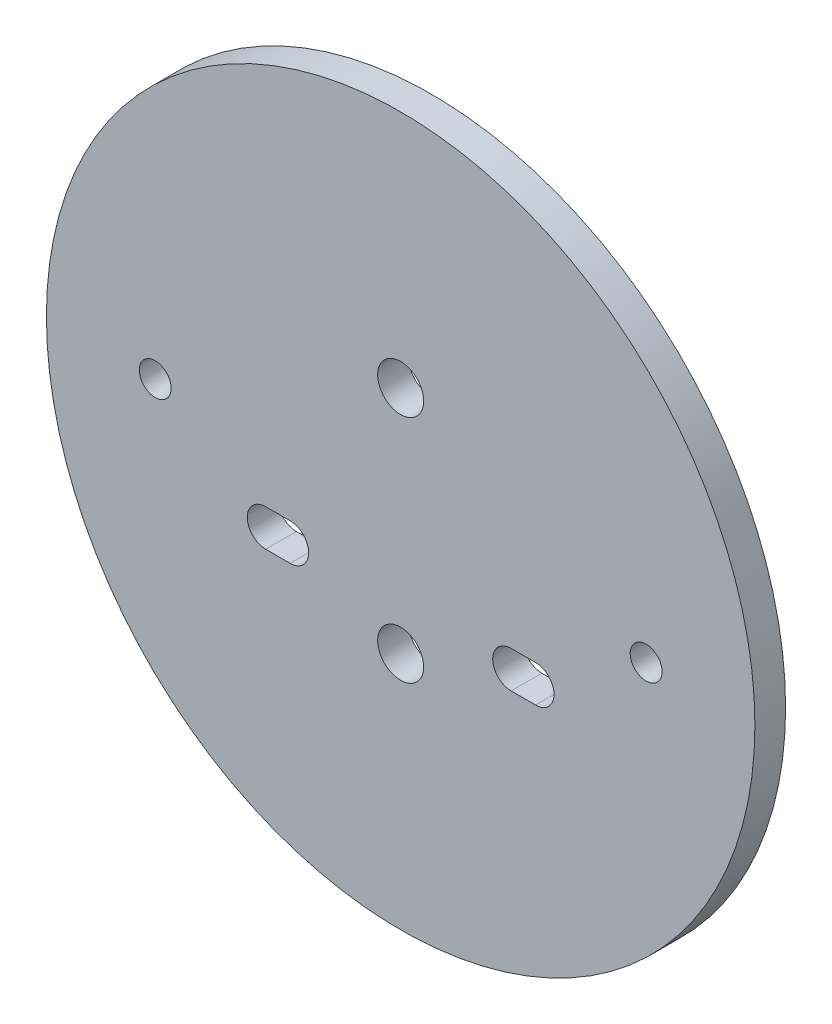
ISO-10303-21;
HEADER;
FILE_DESCRIPTION(('STEP AP214'),'2;1');
FILE_NAME('part.step','',(''),(''),'','','');
FILE_SCHEMA(('AUTOMOTIVE_DESIGN { 1 0 10303 214 1 1 1 1 }'));
ENDSEC;
DATA;
#1=APPLICATION_CONTEXT('core data for automotive mechanical design processes');
#2=APPLICATION_PROTOCOL_DEFINITION('international standard','automotive_design',2000,#1);
#3=PRODUCT_CONTEXT('',#1,'mechanical');
#4=PRODUCT('Part','Part','',(#3));
#5=PRODUCT_RELATED_PRODUCT_CATEGORY('part','',(#4));
#6=PRODUCT_DEFINITION_FORMATION('','',#4);
#7=PRODUCT_DEFINITION_CONTEXT('part definition',#1,'design');
#8=PRODUCT_DEFINITION('design','',#6,#7);
#9=PRODUCT_DEFINITION_SHAPE('','',#8);
#10=(LENGTH_UNIT() NAMED_UNIT(*) SI_UNIT(.MILLI.,.METRE.));
#11=(NAMED_UNIT(*) PLANE_ANGLE_UNIT() SI_UNIT($,.RADIAN.));
#12=(NAMED_UNIT(*) SI_UNIT($,.STERADIAN.) SOLID_ANGLE_UNIT());
#13=UNCERTAINTY_MEASURE_WITH_UNIT(LENGTH_MEASURE(1.E-05),#10,'distance_accuracy_value','');
#14=(GEOMETRIC_REPRESENTATION_CONTEXT(3) GLOBAL_UNCERTAINTY_ASSIGNED_CONTEXT((#13)) GLOBAL_UNIT_ASSIGNED_CONTEXT((#10,
#11,#12)) REPRESENTATION_CONTEXT('',''));
#15=CARTESIAN_POINT('',(0.,0.,0.));
#16=DIRECTION('',(0.,0.,1.));
#17=DIRECTION('',(1.,0.,0.));
#18=AXIS2_PLACEMENT_3D('',#15,#16,#17);
#19=CARTESIAN_POINT('',(0.,0.,3.175));
#20=DIRECTION('',(0.,0.,1.));
#21=DIRECTION('',(1.,0.,0.));
#22=AXIS2_PLACEMENT_3D('',#19,#20,#21);
#23=PLANE('',#22);
#24=CARTESIAN_POINT('',(27.94,-15.24,3.175));
#25=DIRECTION('',(0.,0.,-1.));
#26=DIRECTION('',(-1.,0.,0.));
#27=AXIS2_PLACEMENT_3D('',#24,#25,#26);
#28=CIRCLE('',#27,3.81);
#29=CARTESIAN_POINT('',(27.94,-11.43,3.175));
#30=VERTEX_POINT('',#29);
#31=CARTESIAN_POINT('',(27.94,-19.05,3.175));
#32=VERTEX_POINT('',#31);
#33=EDGE_CURVE('E131',#30,#32,#28,.T.);
#34=ORIENTED_EDGE('',*,*,#33,.T.);
#35=DIRECTION('',(-1.,0.,0.));
#36=VECTOR('',#35,1.);
#37=CARTESIAN_POINT('',(27.94,-19.05,3.175));
#38=LINE('',#37,#36);
#39=CARTESIAN_POINT('',(22.86,-19.05,3.175));
#40=VERTEX_POINT('',#39);
#41=EDGE_CURVE('E134',#32,#40,#38,.T.);
#42=ORIENTED_EDGE('',*,*,#41,.T.);
#43=CARTESIAN_POINT('',(22.86,-15.24,3.175));
#44=DIRECTION('',(0.,0.,-1.));
#45=DIRECTION('',(-1.,0.,0.));
#46=AXIS2_PLACEMENT_3D('',#43,#44,#45);
#47=CIRCLE('',#46,3.81);
#48=CARTESIAN_POINT('',(22.86,-11.43,3.175));
#49=VERTEX_POINT('',#48);
#50=EDGE_CURVE('E138',#40,#49,#47,.T.);
#51=ORIENTED_EDGE('',*,*,#50,.T.);
#52=DIRECTION('',(1.,0.,0.));
#53=VECTOR('',#52,1.);
#54=CARTESIAN_POINT('',(27.94,-11.43,3.175));
#55=LINE('',#54,#53);
#56=EDGE_CURVE('E141',#49,#30,#55,.T.);
#57=ORIENTED_EDGE('',*,*,#56,.T.);
#58=EDGE_LOOP('',(#34,#42,#51,#57));
#59=FACE_BOUND('',#58,.T.);
#60=CARTESIAN_POINT('',(0.,23.8125,3.175));
#61=DIRECTION('',(0.,0.,1.));
#62=DIRECTION('',(1.,0.,0.));
#63=AXIS2_PLACEMENT_3D('',#60,#61,#62);
#64=CIRCLE('',#63,4.7625);
#65=CARTESIAN_POINT('',(4.76250000000001,23.8125,3.175));
#66=VERTEX_POINT('',#65);
#67=EDGE_CURVE('E169',#66,#66,#64,.T.);
#68=ORIENTED_EDGE('',*,*,#67,.F.);
#69=EDGE_LOOP('',(#68));
#70=FACE_BOUND('',#69,.T.);
#71=CARTESIAN_POINT('',(-50.8,0.,3.175));
#72=DIRECTION('',(0.,0.,1.));
#73=DIRECTION('',(1.,0.,0.));
#74=AXIS2_PLACEMENT_3D('',#71,#72,#73);
#75=CIRCLE('',#74,3.302);
#76=CARTESIAN_POINT('',(-47.498,0.,3.175));
#77=VERTEX_POINT('',#76);
#78=EDGE_CURVE('E181',#77,#77,#75,.T.);
#79=ORIENTED_EDGE('',*,*,#78,.F.);
#80=EDGE_LOOP('',(#79));
#81=FACE_BOUND('',#80,.T.);
#82=CARTESIAN_POINT('',(0.,0.,3.175));
#83=DIRECTION('',(0.,0.,1.));
#84=DIRECTION('',(1.,0.,0.));
#85=AXIS2_PLACEMENT_3D('',#82,#83,#84);
#86=CIRCLE('',#85,73.3171);
#87=CARTESIAN_POINT('',(73.3171,0.,3.175));
#88=VERTEX_POINT('',#87);
#89=EDGE_CURVE('E11',#88,#88,#86,.T.);
#90=ORIENTED_EDGE('',*,*,#89,.T.);
#91=EDGE_LOOP('',(#90));
#92=FACE_BOUND('',#91,.T.);
#93=CARTESIAN_POINT('',(50.8,0.,3.175));
#94=DIRECTION('',(0.,0.,1.));
#95=DIRECTION('',(1.,0.,0.));
#96=AXIS2_PLACEMENT_3D('',#93,#94,#95);
#97=CIRCLE('',#96,3.302);
#98=CARTESIAN_POINT('',(54.102,0.,3.175));
#99=VERTEX_POINT('',#98);
#100=EDGE_CURVE('E175',#99,#99,#97,.T.);
#101=ORIENTED_EDGE('',*,*,#100,.F.);
#102=EDGE_LOOP('',(#101));
#103=FACE_BOUND('',#102,.T.);
#104=CARTESIAN_POINT('',(0.,-23.8125,3.175));
#105=DIRECTION('',(0.,0.,1.));
#106=DIRECTION('',(1.,0.,0.));
#107=AXIS2_PLACEMENT_3D('',#104,#105,#106);
#108=CIRCLE('',#107,4.7625);
#109=CARTESIAN_POINT('',(4.76250000000001,-23.8125,3.175));
#110=VERTEX_POINT('',#109);
#111=EDGE_CURVE('E163',#110,#110,#108,.T.);
#112=ORIENTED_EDGE('',*,*,#111,.F.);
#113=EDGE_LOOP('',(#112));
#114=FACE_BOUND('',#113,.T.);
#115=DIRECTION('',(1.,0.,0.));
#116=VECTOR('',#115,1.);
#117=CARTESIAN_POINT('',(-27.94,-19.05,3.175));
#118=LINE('',#117,#116);
#119=CARTESIAN_POINT('',(-27.94,-19.05,3.175));
#120=VERTEX_POINT('',#119);
#121=CARTESIAN_POINT('',(-22.86,-19.05,3.175));
#122=VERTEX_POINT('',#121);
#123=EDGE_CURVE('E109',#120,#122,#118,.T.);
#124=ORIENTED_EDGE('',*,*,#123,.F.);
#125=CARTESIAN_POINT('',(-27.94,-15.24,3.175));
#126=DIRECTION('',(0.,0.,1.));
#127=DIRECTION('',(1.,0.,0.));
#128=AXIS2_PLACEMENT_3D('',#125,#126,#127);
#129=CIRCLE('',#128,3.81);
#130=CARTESIAN_POINT('',(-27.94,-11.43,3.175));
#131=VERTEX_POINT('',#130);
#132=EDGE_CURVE('E105',#131,#120,#129,.T.);
#133=ORIENTED_EDGE('',*,*,#132,.F.);
#134=DIRECTION('',(-1.,0.,0.));
#135=VECTOR('',#134,1.);
#136=CARTESIAN_POINT('',(-27.94,-11.43,3.175));
#137=LINE('',#136,#135);
#138=CARTESIAN_POINT('',(-22.86,-11.43,3.175));
#139=VERTEX_POINT('',#138);
#140=EDGE_CURVE('E97',#139,#131,#137,.T.);
#141=ORIENTED_EDGE('',*,*,#140,.F.);
#142=CARTESIAN_POINT('',(-22.86,-15.24,3.175));
#143=DIRECTION('',(0.,0.,1.));
#144=DIRECTION('',(1.,0.,0.));
#145=AXIS2_PLACEMENT_3D('',#142,#143,#144);
#146=CIRCLE('',#145,3.81);
#147=EDGE_CURVE('E104',#122,#139,#146,.T.);
#148=ORIENTED_EDGE('',*,*,#147,.F.);
#149=EDGE_LOOP('',(#124,#133,#141,#148));
#150=FACE_BOUND('',#149,.T.);
#151=ADVANCED_FACE('F32',(#59,#70,#81,#92,#103,#114,#150),#23,.T.);
#152=CARTESIAN_POINT('',(0.,0.,-3.175));
#153=DIRECTION('',(0.,0.,1.));
#154=DIRECTION('',(1.,0.,0.));
#155=AXIS2_PLACEMENT_3D('',#152,#153,#154);
#156=PLANE('',#155);
#157=CARTESIAN_POINT('',(0.,-23.8125,-3.175));
#158=DIRECTION('',(0.,0.,1.));
#159=DIRECTION('',(1.,0.,0.));
#160=AXIS2_PLACEMENT_3D('',#157,#158,#159);
#161=CIRCLE('',#160,4.7625);
#162=CARTESIAN_POINT('',(4.76250000000001,-23.8125,-3.175));
#163=VERTEX_POINT('',#162);
#164=EDGE_CURVE('E156',#163,#163,#161,.T.);
#165=ORIENTED_EDGE('',*,*,#164,.T.);
#166=EDGE_LOOP('',(#165));
#167=FACE_BOUND('',#166,.T.);
#168=CARTESIAN_POINT('',(0.,23.8125,-3.175));
#169=DIRECTION('',(0.,0.,1.));
#170=DIRECTION('',(1.,0.,0.));
#171=AXIS2_PLACEMENT_3D('',#168,#169,#170);
#172=CIRCLE('',#171,4.7625);
#173=CARTESIAN_POINT('',(4.76250000000001,23.8125,-3.175));
#174=VERTEX_POINT('',#173);
#175=EDGE_CURVE('E166',#174,#174,#172,.T.);
#176=ORIENTED_EDGE('',*,*,#175,.T.);
#177=EDGE_LOOP('',(#176));
#178=FACE_BOUND('',#177,.T.);
#179=CARTESIAN_POINT('',(50.8,0.,-3.175));
#180=DIRECTION('',(0.,0.,1.));
#181=DIRECTION('',(1.,0.,0.));
#182=AXIS2_PLACEMENT_3D('',#179,#180,#181);
#183=CIRCLE('',#182,3.302);
#184=CARTESIAN_POINT('',(54.102,0.,-3.175));
#185=VERTEX_POINT('',#184);
#186=EDGE_CURVE('E172',#185,#185,#183,.T.);
#187=ORIENTED_EDGE('',*,*,#186,.T.);
#188=EDGE_LOOP('',(#187));
#189=FACE_BOUND('',#188,.T.);
#190=CARTESIAN_POINT('',(-50.8,0.,-3.175));
#191=DIRECTION('',(0.,0.,1.));
#192=DIRECTION('',(1.,0.,0.));
#193=AXIS2_PLACEMENT_3D('',#190,#191,#192);
#194=CIRCLE('',#193,3.302);
#195=CARTESIAN_POINT('',(-47.498,0.,-3.175));
#196=VERTEX_POINT('',#195);
#197=EDGE_CURVE('E178',#196,#196,#194,.T.);
#198=ORIENTED_EDGE('',*,*,#197,.T.);
#199=EDGE_LOOP('',(#198));
#200=FACE_BOUND('',#199,.T.);
#201=CARTESIAN_POINT('',(0.,0.,-3.175));
#202=DIRECTION('',(0.,0.,1.));
#203=DIRECTION('',(1.,0.,0.));
#204=AXIS2_PLACEMENT_3D('',#201,#202,#203);
#205=CIRCLE('',#204,73.3171);
#206=CARTESIAN_POINT('',(73.3171,0.,-3.175));
#207=VERTEX_POINT('',#206);
#208=EDGE_CURVE('E36',#207,#207,#205,.T.);
#209=ORIENTED_EDGE('',*,*,#208,.F.);
#210=EDGE_LOOP('',(#209));
#211=FACE_BOUND('',#210,.T.);
#212=DIRECTION('',(-1.,0.,0.));
#213=VECTOR('',#212,1.);
#214=CARTESIAN_POINT('',(27.94,-19.05,-3.175));
#215=LINE('',#214,#213);
#216=CARTESIAN_POINT('',(27.94,-19.05,-3.175));
#217=VERTEX_POINT('',#216);
#218=CARTESIAN_POINT('',(22.86,-19.05,-3.175));
#219=VERTEX_POINT('',#218);
#220=EDGE_CURVE('E146',#217,#219,#215,.T.);
#221=ORIENTED_EDGE('',*,*,#220,.F.);
#222=CARTESIAN_POINT('',(27.94,-15.24,-3.175));
#223=DIRECTION('',(0.,0.,-1.));
#224=DIRECTION('',(-1.,0.,0.));
#225=AXIS2_PLACEMENT_3D('',#222,#223,#224);
#226=CIRCLE('',#225,3.81);
#227=CARTESIAN_POINT('',(27.94,-11.43,-3.175));
#228=VERTEX_POINT('',#227);
#229=EDGE_CURVE('E127',#228,#217,#226,.T.);
#230=ORIENTED_EDGE('',*,*,#229,.F.);
#231=DIRECTION('',(1.,0.,0.));
#232=VECTOR('',#231,1.);
#233=CARTESIAN_POINT('',(27.94,-11.43,-3.175));
#234=LINE('',#233,#232);
#235=CARTESIAN_POINT('',(22.86,-11.43,-3.175));
#236=VERTEX_POINT('',#235);
#237=EDGE_CURVE('E135',#236,#228,#234,.T.);
#238=ORIENTED_EDGE('',*,*,#237,.F.);
#239=CARTESIAN_POINT('',(22.86,-15.24,-3.175));
#240=DIRECTION('',(0.,0.,-1.));
#241=DIRECTION('',(-1.,0.,0.));
#242=AXIS2_PLACEMENT_3D('',#239,#240,#241);
#243=CIRCLE('',#242,3.81);
#244=EDGE_CURVE('E149',#219,#236,#243,.T.);
#245=ORIENTED_EDGE('',*,*,#244,.F.);
#246=EDGE_LOOP('',(#221,#230,#238,#245));
#247=FACE_BOUND('',#246,.T.);
#248=CARTESIAN_POINT('',(-27.94,-15.24,-3.175));
#249=DIRECTION('',(0.,0.,1.));
#250=DIRECTION('',(1.,0.,0.));
#251=AXIS2_PLACEMENT_3D('',#248,#249,#250);
#252=CIRCLE('',#251,3.81);
#253=CARTESIAN_POINT('',(-27.94,-11.43,-3.175));
#254=VERTEX_POINT('',#253);
#255=CARTESIAN_POINT('',(-27.94,-19.05,-3.175));
#256=VERTEX_POINT('',#255);
#257=EDGE_CURVE('E55',#254,#256,#252,.T.);
#258=ORIENTED_EDGE('',*,*,#257,.T.);
#259=DIRECTION('',(1.,0.,0.));
#260=VECTOR('',#259,1.);
#261=CARTESIAN_POINT('',(-27.94,-19.05,-3.175));
#262=LINE('',#261,#260);
#263=CARTESIAN_POINT('',(-22.86,-19.05,-3.175));
#264=VERTEX_POINT('',#263);
#265=EDGE_CURVE('E112',#256,#264,#262,.T.);
#266=ORIENTED_EDGE('',*,*,#265,.T.);
#267=CARTESIAN_POINT('',(-22.86,-15.24,-3.175));
#268=DIRECTION('',(0.,0.,1.));
#269=DIRECTION('',(1.,0.,0.));
#270=AXIS2_PLACEMENT_3D('',#267,#268,#269);
#271=CIRCLE('',#270,3.81);
#272=CARTESIAN_POINT('',(-22.86,-11.43,-3.175));
#273=VERTEX_POINT('',#272);
#274=EDGE_CURVE('E115',#264,#273,#271,.T.);
#275=ORIENTED_EDGE('',*,*,#274,.T.);
#276=DIRECTION('',(-1.,0.,0.));
#277=VECTOR('',#276,1.);
#278=CARTESIAN_POINT('',(-27.94,-11.43,-3.175));
#279=LINE('',#278,#277);
#280=EDGE_CURVE('E121',#273,#254,#279,.T.);
#281=ORIENTED_EDGE('',*,*,#280,.T.);
#282=EDGE_LOOP('',(#258,#266,#275,#281));
#283=FACE_BOUND('',#282,.T.);
#284=ADVANCED_FACE('F187',(#167,#178,#189,#200,#211,#247,#283),#156,.F.);
#285=CARTESIAN_POINT('',(0.,0.,3.175));
#286=DIRECTION('',(0.,0.,-1.));
#287=DIRECTION('',(-1.,0.,0.));
#288=AXIS2_PLACEMENT_3D('',#285,#286,#287);
#289=CYLINDRICAL_SURFACE('',#288,73.3171);
#290=ORIENTED_EDGE('',*,*,#89,.F.);
#291=EDGE_LOOP('',(#290));
#292=FACE_BOUND('',#291,.T.);
#293=ORIENTED_EDGE('',*,*,#208,.T.);
#294=EDGE_LOOP('',(#293));
#295=FACE_BOUND('',#294,.T.);
#296=ADVANCED_FACE('F34',(#292,#295),#289,.T.);
#297=CARTESIAN_POINT('',(-50.8,0.,3.175));
#298=DIRECTION('',(0.,0.,-1.));
#299=DIRECTION('',(-1.,0.,0.));
#300=AXIS2_PLACEMENT_3D('',#297,#298,#299);
#301=CYLINDRICAL_SURFACE('',#300,3.302);
#302=ORIENTED_EDGE('',*,*,#78,.T.);
#303=EDGE_LOOP('',(#302));
#304=FACE_BOUND('',#303,.T.);
#305=ORIENTED_EDGE('',*,*,#197,.F.);
#306=EDGE_LOOP('',(#305));
#307=FACE_BOUND('',#306,.T.);
#308=ADVANCED_FACE('F190',(#304,#307),#301,.F.);
#309=CARTESIAN_POINT('',(50.8,0.,3.175));
#310=DIRECTION('',(0.,0.,-1.));
#311=DIRECTION('',(-1.,0.,0.));
#312=AXIS2_PLACEMENT_3D('',#309,#310,#311);
#313=CYLINDRICAL_SURFACE('',#312,3.302);
#314=ORIENTED_EDGE('',*,*,#100,.T.);
#315=EDGE_LOOP('',(#314));
#316=FACE_BOUND('',#315,.T.);
#317=ORIENTED_EDGE('',*,*,#186,.F.);
#318=EDGE_LOOP('',(#317));
#319=FACE_BOUND('',#318,.T.);
#320=ADVANCED_FACE('F192',(#316,#319),#313,.F.);
#321=CARTESIAN_POINT('',(0.,23.8125,3.175));
#322=DIRECTION('',(0.,0.,-1.));
#323=DIRECTION('',(-1.,0.,0.));
#324=AXIS2_PLACEMENT_3D('',#321,#322,#323);
#325=CYLINDRICAL_SURFACE('',#324,4.7625);
#326=ORIENTED_EDGE('',*,*,#67,.T.);
#327=EDGE_LOOP('',(#326));
#328=FACE_BOUND('',#327,.T.);
#329=ORIENTED_EDGE('',*,*,#175,.F.);
#330=EDGE_LOOP('',(#329));
#331=FACE_BOUND('',#330,.T.);
#332=ADVANCED_FACE('F199',(#328,#331),#325,.F.);
#333=CARTESIAN_POINT('',(0.,-23.8125,3.175));
#334=DIRECTION('',(0.,0.,-1.));
#335=DIRECTION('',(-1.,0.,0.));
#336=AXIS2_PLACEMENT_3D('',#333,#334,#335);
#337=CYLINDRICAL_SURFACE('',#336,4.7625);
#338=ORIENTED_EDGE('',*,*,#111,.T.);
#339=EDGE_LOOP('',(#338));
#340=FACE_BOUND('',#339,.T.);
#341=ORIENTED_EDGE('',*,*,#164,.F.);
#342=EDGE_LOOP('',(#341));
#343=FACE_BOUND('',#342,.T.);
#344=ADVANCED_FACE('F222',(#340,#343),#337,.F.);
#345=CARTESIAN_POINT('',(27.94,-15.24,3.175));
#346=DIRECTION('',(0.,0.,-1.));
#347=DIRECTION('',(-1.,0.,0.));
#348=AXIS2_PLACEMENT_3D('',#345,#346,#347);
#349=CYLINDRICAL_SURFACE('',#348,3.81);
#350=ORIENTED_EDGE('',*,*,#229,.T.);
#351=DIRECTION('',(0.,0.,-1.));
#352=VECTOR('',#351,1.);
#353=CARTESIAN_POINT('',(27.94,-19.05,3.175));
#354=LINE('',#353,#352);
#355=EDGE_CURVE('E144',#32,#217,#354,.T.);
#356=ORIENTED_EDGE('',*,*,#355,.F.);
#357=ORIENTED_EDGE('',*,*,#33,.F.);
#358=DIRECTION('',(0.,0.,-1.));
#359=VECTOR('',#358,1.);
#360=CARTESIAN_POINT('',(27.94,-11.43,3.175));
#361=LINE('',#360,#359);
#362=EDGE_CURVE('E154',#30,#228,#361,.T.);
#363=ORIENTED_EDGE('',*,*,#362,.T.);
#364=EDGE_LOOP('',(#350,#356,#357,#363));
#365=FACE_BOUND('',#364,.T.);
#366=ADVANCED_FACE('F225',(#365),#349,.F.);
#367=CARTESIAN_POINT('',(27.94,-11.43,3.175));
#368=DIRECTION('',(0.,1.,0.));
#369=DIRECTION('',(-1.,0.,0.));
#370=AXIS2_PLACEMENT_3D('',#367,#368,#369);
#371=PLANE('',#370);
#372=ORIENTED_EDGE('',*,*,#237,.T.);
#373=ORIENTED_EDGE('',*,*,#362,.F.);
#374=ORIENTED_EDGE('',*,*,#56,.F.);
#375=DIRECTION('',(0.,0.,-1.));
#376=VECTOR('',#375,1.);
#377=CARTESIAN_POINT('',(22.86,-11.43,3.175));
#378=LINE('',#377,#376);
#379=EDGE_CURVE('E157',#49,#236,#378,.T.);
#380=ORIENTED_EDGE('',*,*,#379,.T.);
#381=EDGE_LOOP('',(#372,#373,#374,#380));
#382=FACE_BOUND('',#381,.T.);
#383=ADVANCED_FACE('F242',(#382),#371,.F.);
#384=CARTESIAN_POINT('',(22.86,-15.24,3.175));
#385=DIRECTION('',(0.,0.,-1.));
#386=DIRECTION('',(-1.,0.,0.));
#387=AXIS2_PLACEMENT_3D('',#384,#385,#386);
#388=CYLINDRICAL_SURFACE('',#387,3.81);
#389=ORIENTED_EDGE('',*,*,#244,.T.);
#390=ORIENTED_EDGE('',*,*,#379,.F.);
#391=ORIENTED_EDGE('',*,*,#50,.F.);
#392=DIRECTION('',(0.,0.,-1.));
#393=VECTOR('',#392,1.);
#394=CARTESIAN_POINT('',(22.86,-19.05,3.175));
#395=LINE('',#394,#393);
#396=EDGE_CURVE('E159',#40,#219,#395,.T.);
#397=ORIENTED_EDGE('',*,*,#396,.T.);
#398=EDGE_LOOP('',(#389,#390,#391,#397));
#399=FACE_BOUND('',#398,.T.);
#400=ADVANCED_FACE('F247',(#399),#388,.F.);
#401=CARTESIAN_POINT('',(27.94,-19.05,3.175));
#402=DIRECTION('',(0.,-1.,0.));
#403=DIRECTION('',(0.,0.,-1.));
#404=AXIS2_PLACEMENT_3D('',#401,#402,#403);
#405=PLANE('',#404);
#406=ORIENTED_EDGE('',*,*,#220,.T.);
#407=ORIENTED_EDGE('',*,*,#396,.F.);
#408=ORIENTED_EDGE('',*,*,#41,.F.);
#409=ORIENTED_EDGE('',*,*,#355,.T.);
#410=EDGE_LOOP('',(#406,#407,#408,#409));
#411=FACE_BOUND('',#410,.T.);
#412=ADVANCED_FACE('F244',(#411),#405,.F.);
#413=CARTESIAN_POINT('',(-27.94,-15.24,3.175));
#414=DIRECTION('',(0.,0.,-1.));
#415=DIRECTION('',(-1.,0.,0.));
#416=AXIS2_PLACEMENT_3D('',#413,#414,#415);
#417=CYLINDRICAL_SURFACE('',#416,3.81);
#418=ORIENTED_EDGE('',*,*,#257,.F.);
#419=DIRECTION('',(0.,0.,-1.));
#420=VECTOR('',#419,1.);
#421=CARTESIAN_POINT('',(-27.94,-11.43,3.175));
#422=LINE('',#421,#420);
#423=EDGE_CURVE('E99',#131,#254,#422,.T.);
#424=ORIENTED_EDGE('',*,*,#423,.F.);
#425=ORIENTED_EDGE('',*,*,#132,.T.);
#426=DIRECTION('',(0.,0.,-1.));
#427=VECTOR('',#426,1.);
#428=CARTESIAN_POINT('',(-27.94,-19.05,3.175));
#429=LINE('',#428,#427);
#430=EDGE_CURVE('E125',#120,#256,#429,.T.);
#431=ORIENTED_EDGE('',*,*,#430,.T.);
#432=EDGE_LOOP('',(#418,#424,#425,#431));
#433=FACE_BOUND('',#432,.T.);
#434=ADVANCED_FACE('F107',(#433),#417,.F.);
#435=CARTESIAN_POINT('',(-27.94,-19.05,3.175));
#436=DIRECTION('',(0.,1.,0.));
#437=DIRECTION('',(0.,0.,1.));
#438=AXIS2_PLACEMENT_3D('',#435,#436,#437);
#439=PLANE('',#438);
#440=ORIENTED_EDGE('',*,*,#265,.F.);
#441=ORIENTED_EDGE('',*,*,#430,.F.);
#442=ORIENTED_EDGE('',*,*,#123,.T.);
#443=DIRECTION('',(0.,0.,-1.));
#444=VECTOR('',#443,1.);
#445=CARTESIAN_POINT('',(-22.86,-19.05,3.175));
#446=LINE('',#445,#444);
#447=EDGE_CURVE('E128',#122,#264,#446,.T.);
#448=ORIENTED_EDGE('',*,*,#447,.T.);
#449=EDGE_LOOP('',(#440,#441,#442,#448));
#450=FACE_BOUND('',#449,.T.);
#451=ADVANCED_FACE('F257',(#450),#439,.T.);
#452=CARTESIAN_POINT('',(-22.86,-15.24,3.175));
#453=DIRECTION('',(0.,0.,-1.));
#454=DIRECTION('',(-1.,0.,0.));
#455=AXIS2_PLACEMENT_3D('',#452,#453,#454);
#456=CYLINDRICAL_SURFACE('',#455,3.81);
#457=ORIENTED_EDGE('',*,*,#274,.F.);
#458=ORIENTED_EDGE('',*,*,#447,.F.);
#459=ORIENTED_EDGE('',*,*,#147,.T.);
#460=DIRECTION('',(0.,0.,-1.));
#461=VECTOR('',#460,1.);
#462=CARTESIAN_POINT('',(-22.86,-11.43,3.175));
#463=LINE('',#462,#461);
#464=EDGE_CURVE('E47',#139,#273,#463,.T.);
#465=ORIENTED_EDGE('',*,*,#464,.T.);
#466=EDGE_LOOP('',(#457,#458,#459,#465));
#467=FACE_BOUND('',#466,.T.);
#468=ADVANCED_FACE('F260',(#467),#456,.F.);
#469=CARTESIAN_POINT('',(-27.94,-11.43,3.175));
#470=DIRECTION('',(0.,-1.,0.));
#471=DIRECTION('',(1.,0.,0.));
#472=AXIS2_PLACEMENT_3D('',#469,#470,#471);
#473=PLANE('',#472);
#474=ORIENTED_EDGE('',*,*,#280,.F.);
#475=ORIENTED_EDGE('',*,*,#464,.F.);
#476=ORIENTED_EDGE('',*,*,#140,.T.);
#477=ORIENTED_EDGE('',*,*,#423,.T.);
#478=EDGE_LOOP('',(#474,#475,#476,#477));
#479=FACE_BOUND('',#478,.T.);
#480=ADVANCED_FACE('F98',(#479),#473,.T.);
#481=CLOSED_SHELL('',(#151,#284,#296,#308,#320,#332,#344,#366,#383,#400,#412,#434,#451,#468,#480));
#482=MANIFOLD_SOLID_BREP('B2',#481);
#483=ADVANCED_BREP_SHAPE_REPRESENTATION('',(#18,#482),#14);
#484=SHAPE_DEFINITION_REPRESENTATION(#9,#483);
ENDSEC;
END-ISO-10303-21;
